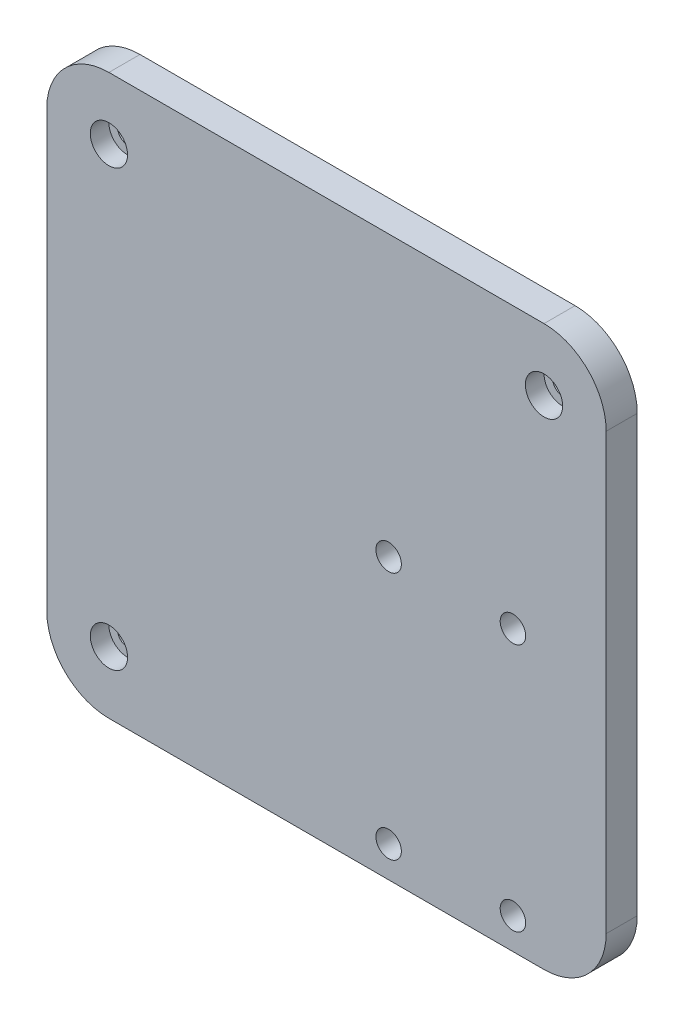
ISO-10303-21;
HEADER;
FILE_DESCRIPTION(('STEP AP214'),'2;1');
FILE_NAME('part.step','',(''),(''),'','','');
FILE_SCHEMA(('AUTOMOTIVE_DESIGN { 1 0 10303 214 1 1 1 1 }'));
ENDSEC;
DATA;
#1=APPLICATION_CONTEXT('core data for automotive mechanical design processes');
#2=APPLICATION_PROTOCOL_DEFINITION('international standard','automotive_design',2000,#1);
#3=PRODUCT_CONTEXT('',#1,'mechanical');
#4=PRODUCT('Part','Part','',(#3));
#5=PRODUCT_RELATED_PRODUCT_CATEGORY('part','',(#4));
#6=PRODUCT_DEFINITION_FORMATION('','',#4);
#7=PRODUCT_DEFINITION_CONTEXT('part definition',#1,'design');
#8=PRODUCT_DEFINITION('design','',#6,#7);
#9=PRODUCT_DEFINITION_SHAPE('','',#8);
#10=(LENGTH_UNIT() NAMED_UNIT(*) SI_UNIT(.MILLI.,.METRE.));
#11=(NAMED_UNIT(*) PLANE_ANGLE_UNIT() SI_UNIT($,.RADIAN.));
#12=(NAMED_UNIT(*) SI_UNIT($,.STERADIAN.) SOLID_ANGLE_UNIT());
#13=UNCERTAINTY_MEASURE_WITH_UNIT(LENGTH_MEASURE(1.E-05),#10,'distance_accuracy_value','');
#14=(GEOMETRIC_REPRESENTATION_CONTEXT(3) GLOBAL_UNCERTAINTY_ASSIGNED_CONTEXT((#13)) GLOBAL_UNIT_ASSIGNED_CONTEXT((#10,
#11,#12)) REPRESENTATION_CONTEXT('',''));
#15=CARTESIAN_POINT('',(0.,0.,0.));
#16=DIRECTION('',(0.,0.,1.));
#17=DIRECTION('',(1.,0.,0.));
#18=AXIS2_PLACEMENT_3D('',#15,#16,#17);
#19=CARTESIAN_POINT('',(-35.,-35.,5.));
#20=DIRECTION('',(0.,0.,-1.));
#21=DIRECTION('',(-1.,0.,0.));
#22=AXIS2_PLACEMENT_3D('',#19,#20,#21);
#23=CYLINDRICAL_SURFACE('',#22,1.60000000000001);
#24=CARTESIAN_POINT('',(-35.,-35.,0.));
#25=DIRECTION('',(0.,0.,1.));
#26=DIRECTION('',(1.,0.,0.));
#27=AXIS2_PLACEMENT_3D('',#24,#25,#26);
#28=CIRCLE('',#27,1.60000000000001);
#29=CARTESIAN_POINT('',(-33.4,-35.,0.));
#30=VERTEX_POINT('',#29);
#31=EDGE_CURVE('E136',#30,#30,#28,.T.);
#32=ORIENTED_EDGE('',*,*,#31,.F.);
#33=EDGE_LOOP('',(#32));
#34=FACE_BOUND('',#33,.T.);
#35=CARTESIAN_POINT('',(-35.,-35.,2.));
#36=DIRECTION('',(0.,0.,1.));
#37=DIRECTION('',(1.,0.,0.));
#38=AXIS2_PLACEMENT_3D('',#35,#36,#37);
#39=CIRCLE('',#38,1.60000000000001);
#40=CARTESIAN_POINT('',(-33.4,-35.,2.));
#41=VERTEX_POINT('',#40);
#42=EDGE_CURVE('E37',#41,#41,#39,.T.);
#43=ORIENTED_EDGE('',*,*,#42,.T.);
#44=EDGE_LOOP('',(#43));
#45=FACE_BOUND('',#44,.T.);
#46=ADVANCED_FACE('F33',(#34,#45),#23,.F.);
#47=CARTESIAN_POINT('',(-35.,35.,5.));
#48=DIRECTION('',(0.,0.,-1.));
#49=DIRECTION('',(-1.,0.,0.));
#50=AXIS2_PLACEMENT_3D('',#47,#48,#49);
#51=CYLINDRICAL_SURFACE('',#50,1.60000000000001);
#52=CARTESIAN_POINT('',(-35.,35.,0.));
#53=DIRECTION('',(0.,0.,1.));
#54=DIRECTION('',(1.,0.,0.));
#55=AXIS2_PLACEMENT_3D('',#52,#53,#54);
#56=CIRCLE('',#55,1.60000000000001);
#57=CARTESIAN_POINT('',(-33.4,35.,0.));
#58=VERTEX_POINT('',#57);
#59=EDGE_CURVE('E171',#58,#58,#56,.T.);
#60=ORIENTED_EDGE('',*,*,#59,.F.);
#61=EDGE_LOOP('',(#60));
#62=FACE_BOUND('',#61,.T.);
#63=CARTESIAN_POINT('',(-35.,35.,2.));
#64=DIRECTION('',(0.,0.,1.));
#65=DIRECTION('',(1.,0.,0.));
#66=AXIS2_PLACEMENT_3D('',#63,#64,#65);
#67=CIRCLE('',#66,1.60000000000001);
#68=CARTESIAN_POINT('',(-33.4,35.,2.));
#69=VERTEX_POINT('',#68);
#70=EDGE_CURVE('E161',#69,#69,#67,.T.);
#71=ORIENTED_EDGE('',*,*,#70,.T.);
#72=EDGE_LOOP('',(#71));
#73=FACE_BOUND('',#72,.T.);
#74=ADVANCED_FACE('F220',(#62,#73),#51,.F.);
#75=CARTESIAN_POINT('',(35.,35.,5.));
#76=DIRECTION('',(0.,0.,-1.));
#77=DIRECTION('',(-1.,0.,0.));
#78=AXIS2_PLACEMENT_3D('',#75,#76,#77);
#79=CYLINDRICAL_SURFACE('',#78,1.60000000000001);
#80=CARTESIAN_POINT('',(35.,35.,0.));
#81=DIRECTION('',(0.,0.,1.));
#82=DIRECTION('',(1.,0.,0.));
#83=AXIS2_PLACEMENT_3D('',#80,#81,#82);
#84=CIRCLE('',#83,1.60000000000001);
#85=CARTESIAN_POINT('',(36.6,35.,0.));
#86=VERTEX_POINT('',#85);
#87=EDGE_CURVE('E167',#86,#86,#84,.T.);
#88=ORIENTED_EDGE('',*,*,#87,.F.);
#89=EDGE_LOOP('',(#88));
#90=FACE_BOUND('',#89,.T.);
#91=CARTESIAN_POINT('',(35.,35.,2.));
#92=DIRECTION('',(0.,0.,1.));
#93=DIRECTION('',(1.,0.,0.));
#94=AXIS2_PLACEMENT_3D('',#91,#92,#93);
#95=CIRCLE('',#94,1.60000000000001);
#96=CARTESIAN_POINT('',(36.6,35.,2.));
#97=VERTEX_POINT('',#96);
#98=EDGE_CURVE('E159',#97,#97,#95,.T.);
#99=ORIENTED_EDGE('',*,*,#98,.T.);
#100=EDGE_LOOP('',(#99));
#101=FACE_BOUND('',#100,.T.);
#102=ADVANCED_FACE('F226',(#90,#101),#79,.F.);
#103=CARTESIAN_POINT('',(35.,35.,5.));
#104=DIRECTION('',(0.,0.,-1.));
#105=DIRECTION('',(-1.,0.,0.));
#106=AXIS2_PLACEMENT_3D('',#103,#104,#105);
#107=PLANE('',#106);
#108=CARTESIAN_POINT('',(30.,-40.,5.));
#109=DIRECTION('',(0.,0.,1.));
#110=DIRECTION('',(1.,0.,0.));
#111=AXIS2_PLACEMENT_3D('',#108,#109,#110);
#112=CIRCLE('',#111,2.05);
#113=CARTESIAN_POINT('',(32.05,-40.,5.));
#114=VERTEX_POINT('',#113);
#115=EDGE_CURVE('E267',#114,#114,#112,.T.);
#116=ORIENTED_EDGE('',*,*,#115,.F.);
#117=EDGE_LOOP('',(#116));
#118=FACE_BOUND('',#117,.T.);
#119=CARTESIAN_POINT('',(10.,-40.,5.));
#120=DIRECTION('',(0.,0.,1.));
#121=DIRECTION('',(1.,0.,0.));
#122=AXIS2_PLACEMENT_3D('',#119,#120,#121);
#123=CIRCLE('',#122,2.05);
#124=CARTESIAN_POINT('',(12.05,-40.,5.));
#125=VERTEX_POINT('',#124);
#126=EDGE_CURVE('E478',#125,#125,#123,.T.);
#127=ORIENTED_EDGE('',*,*,#126,.F.);
#128=EDGE_LOOP('',(#127));
#129=FACE_BOUND('',#128,.T.);
#130=CARTESIAN_POINT('',(10.,0.,5.));
#131=DIRECTION('',(0.,0.,1.));
#132=DIRECTION('',(1.,0.,0.));
#133=AXIS2_PLACEMENT_3D('',#130,#131,#132);
#134=CIRCLE('',#133,2.05);
#135=CARTESIAN_POINT('',(12.05,0.,5.));
#136=VERTEX_POINT('',#135);
#137=EDGE_CURVE('E483',#136,#136,#134,.T.);
#138=ORIENTED_EDGE('',*,*,#137,.F.);
#139=EDGE_LOOP('',(#138));
#140=FACE_BOUND('',#139,.T.);
#141=CARTESIAN_POINT('',(30.,0.,5.));
#142=DIRECTION('',(0.,0.,1.));
#143=DIRECTION('',(1.,0.,0.));
#144=AXIS2_PLACEMENT_3D('',#141,#142,#143);
#145=CIRCLE('',#144,2.05);
#146=CARTESIAN_POINT('',(32.05,0.,5.));
#147=VERTEX_POINT('',#146);
#148=EDGE_CURVE('E259',#147,#147,#145,.T.);
#149=ORIENTED_EDGE('',*,*,#148,.F.);
#150=EDGE_LOOP('',(#149));
#151=FACE_BOUND('',#150,.T.);
#152=CARTESIAN_POINT('',(-35.,-35.,5.));
#153=DIRECTION('',(0.,0.,1.));
#154=DIRECTION('',(1.,0.,0.));
#155=AXIS2_PLACEMENT_3D('',#152,#153,#154);
#156=CIRCLE('',#155,2.99999999999999);
#157=CARTESIAN_POINT('',(-32.,-35.,5.));
#158=VERTEX_POINT('',#157);
#159=EDGE_CURVE('E258',#158,#158,#156,.T.);
#160=ORIENTED_EDGE('',*,*,#159,.F.);
#161=EDGE_LOOP('',(#160));
#162=FACE_BOUND('',#161,.T.);
#163=CARTESIAN_POINT('',(35.,35.,5.));
#164=DIRECTION('',(0.,0.,1.));
#165=DIRECTION('',(1.,0.,0.));
#166=AXIS2_PLACEMENT_3D('',#163,#164,#165);
#167=CIRCLE('',#166,3.);
#168=CARTESIAN_POINT('',(38.,35.,5.));
#169=VERTEX_POINT('',#168);
#170=EDGE_CURVE('E273',#169,#169,#167,.T.);
#171=ORIENTED_EDGE('',*,*,#170,.F.);
#172=EDGE_LOOP('',(#171));
#173=FACE_BOUND('',#172,.T.);
#174=CARTESIAN_POINT('',(-35.,35.,5.));
#175=DIRECTION('',(0.,0.,1.));
#176=DIRECTION('',(1.,0.,0.));
#177=AXIS2_PLACEMENT_3D('',#174,#175,#176);
#178=CIRCLE('',#177,2.99999999999999);
#179=CARTESIAN_POINT('',(-32.,35.,5.));
#180=VERTEX_POINT('',#179);
#181=EDGE_CURVE('E178',#180,#180,#178,.T.);
#182=ORIENTED_EDGE('',*,*,#181,.F.);
#183=EDGE_LOOP('',(#182));
#184=FACE_BOUND('',#183,.T.);
#185=CARTESIAN_POINT('',(35.,35.,5.));
#186=DIRECTION('',(0.,0.,1.));
#187=DIRECTION('',(-1.,0.,0.));
#188=AXIS2_PLACEMENT_3D('',#185,#186,#187);
#189=CIRCLE('',#188,10.);
#190=CARTESIAN_POINT('',(45.,35.,5.));
#191=VERTEX_POINT('',#190);
#192=CARTESIAN_POINT('',(35.,45.,5.));
#193=VERTEX_POINT('',#192);
#194=EDGE_CURVE('E147',#191,#193,#189,.T.);
#195=ORIENTED_EDGE('',*,*,#194,.T.);
#196=DIRECTION('',(-1.,0.,0.));
#197=VECTOR('',#196,1.);
#198=CARTESIAN_POINT('',(-35.,45.,5.));
#199=LINE('',#198,#197);
#200=CARTESIAN_POINT('',(-35.,45.,5.));
#201=VERTEX_POINT('',#200);
#202=EDGE_CURVE('E95',#193,#201,#199,.T.);
#203=ORIENTED_EDGE('',*,*,#202,.T.);
#204=CARTESIAN_POINT('',(-35.,35.,5.));
#205=DIRECTION('',(0.,0.,1.));
#206=DIRECTION('',(1.,0.,0.));
#207=AXIS2_PLACEMENT_3D('',#204,#205,#206);
#208=CIRCLE('',#207,10.);
#209=CARTESIAN_POINT('',(-45.,35.,5.));
#210=VERTEX_POINT('',#209);
#211=EDGE_CURVE('E185',#201,#210,#208,.T.);
#212=ORIENTED_EDGE('',*,*,#211,.T.);
#213=DIRECTION('',(0.,-1.,0.));
#214=VECTOR('',#213,1.);
#215=CARTESIAN_POINT('',(-45.,35.,5.));
#216=LINE('',#215,#214);
#217=CARTESIAN_POINT('',(-45.,-35.,5.));
#218=VERTEX_POINT('',#217);
#219=EDGE_CURVE('E187',#210,#218,#216,.T.);
#220=ORIENTED_EDGE('',*,*,#219,.T.);
#221=CARTESIAN_POINT('',(-35.,-35.,5.));
#222=DIRECTION('',(0.,0.,1.));
#223=DIRECTION('',(1.,0.,0.));
#224=AXIS2_PLACEMENT_3D('',#221,#222,#223);
#225=CIRCLE('',#224,10.);
#226=CARTESIAN_POINT('',(-35.,-45.,5.));
#227=VERTEX_POINT('',#226);
#228=EDGE_CURVE('E114',#218,#227,#225,.T.);
#229=ORIENTED_EDGE('',*,*,#228,.T.);
#230=DIRECTION('',(1.,0.,0.));
#231=VECTOR('',#230,1.);
#232=CARTESIAN_POINT('',(-35.,-45.,5.));
#233=LINE('',#232,#231);
#234=CARTESIAN_POINT('',(35.,-45.,5.));
#235=VERTEX_POINT('',#234);
#236=EDGE_CURVE('E108',#227,#235,#233,.T.);
#237=ORIENTED_EDGE('',*,*,#236,.T.);
#238=CARTESIAN_POINT('',(35.,-35.,5.));
#239=DIRECTION('',(0.,0.,1.));
#240=DIRECTION('',(1.,0.,0.));
#241=AXIS2_PLACEMENT_3D('',#238,#239,#240);
#242=CIRCLE('',#241,10.);
#243=CARTESIAN_POINT('',(45.,-35.,5.));
#244=VERTEX_POINT('',#243);
#245=EDGE_CURVE('E112',#235,#244,#242,.T.);
#246=ORIENTED_EDGE('',*,*,#245,.T.);
#247=DIRECTION('',(0.,1.,0.));
#248=VECTOR('',#247,1.);
#249=CARTESIAN_POINT('',(45.,35.,5.));
#250=LINE('',#249,#248);
#251=EDGE_CURVE('E52',#244,#191,#250,.T.);
#252=ORIENTED_EDGE('',*,*,#251,.T.);
#253=EDGE_LOOP('',(#195,#203,#212,#220,#229,#237,#246,#252));
#254=FACE_BOUND('',#253,.T.);
#255=ADVANCED_FACE('F110',(#118,#129,#140,#151,#162,#173,#184,#254),#107,.F.);
#256=CARTESIAN_POINT('',(35.,35.,0.));
#257=DIRECTION('',(0.,0.,-1.));
#258=DIRECTION('',(-1.,0.,0.));
#259=AXIS2_PLACEMENT_3D('',#256,#257,#258);
#260=PLANE('',#259);
#261=CARTESIAN_POINT('',(30.,-40.,0.));
#262=DIRECTION('',(0.,0.,1.));
#263=DIRECTION('',(1.,0.,0.));
#264=AXIS2_PLACEMENT_3D('',#261,#262,#263);
#265=CIRCLE('',#264,2.05);
#266=CARTESIAN_POINT('',(32.05,-40.,0.));
#267=VERTEX_POINT('',#266);
#268=EDGE_CURVE('E243',#267,#267,#265,.T.);
#269=ORIENTED_EDGE('',*,*,#268,.T.);
#270=EDGE_LOOP('',(#269));
#271=FACE_BOUND('',#270,.T.);
#272=CARTESIAN_POINT('',(10.,-40.,0.));
#273=DIRECTION('',(0.,0.,1.));
#274=DIRECTION('',(1.,0.,0.));
#275=AXIS2_PLACEMENT_3D('',#272,#273,#274);
#276=CIRCLE('',#275,2.05);
#277=CARTESIAN_POINT('',(12.05,-40.,0.));
#278=VERTEX_POINT('',#277);
#279=EDGE_CURVE('E247',#278,#278,#276,.T.);
#280=ORIENTED_EDGE('',*,*,#279,.T.);
#281=EDGE_LOOP('',(#280));
#282=FACE_BOUND('',#281,.T.);
#283=CARTESIAN_POINT('',(10.,0.,0.));
#284=DIRECTION('',(0.,0.,1.));
#285=DIRECTION('',(1.,0.,0.));
#286=AXIS2_PLACEMENT_3D('',#283,#284,#285);
#287=CIRCLE('',#286,2.05);
#288=CARTESIAN_POINT('',(12.05,0.,0.));
#289=VERTEX_POINT('',#288);
#290=EDGE_CURVE('E251',#289,#289,#287,.T.);
#291=ORIENTED_EDGE('',*,*,#290,.T.);
#292=EDGE_LOOP('',(#291));
#293=FACE_BOUND('',#292,.T.);
#294=CARTESIAN_POINT('',(30.,0.,0.));
#295=DIRECTION('',(0.,0.,1.));
#296=DIRECTION('',(1.,0.,0.));
#297=AXIS2_PLACEMENT_3D('',#294,#295,#296);
#298=CIRCLE('',#297,2.05);
#299=CARTESIAN_POINT('',(32.05,0.,0.));
#300=VERTEX_POINT('',#299);
#301=EDGE_CURVE('E255',#300,#300,#298,.T.);
#302=ORIENTED_EDGE('',*,*,#301,.T.);
#303=EDGE_LOOP('',(#302));
#304=FACE_BOUND('',#303,.T.);
#305=ORIENTED_EDGE('',*,*,#59,.T.);
#306=EDGE_LOOP('',(#305));
#307=FACE_BOUND('',#306,.T.);
#308=CARTESIAN_POINT('',(35.,35.,0.));
#309=DIRECTION('',(0.,0.,1.));
#310=DIRECTION('',(-1.,0.,0.));
#311=AXIS2_PLACEMENT_3D('',#308,#309,#310);
#312=CIRCLE('',#311,10.);
#313=CARTESIAN_POINT('',(45.,35.,0.));
#314=VERTEX_POINT('',#313);
#315=CARTESIAN_POINT('',(35.,45.,0.));
#316=VERTEX_POINT('',#315);
#317=EDGE_CURVE('E132',#314,#316,#312,.T.);
#318=ORIENTED_EDGE('',*,*,#317,.F.);
#319=DIRECTION('',(0.,1.,0.));
#320=VECTOR('',#319,1.);
#321=CARTESIAN_POINT('',(45.,35.,0.));
#322=LINE('',#321,#320);
#323=CARTESIAN_POINT('',(45.,-35.,0.));
#324=VERTEX_POINT('',#323);
#325=EDGE_CURVE('E87',#324,#314,#322,.T.);
#326=ORIENTED_EDGE('',*,*,#325,.F.);
#327=CARTESIAN_POINT('',(35.,-35.,0.));
#328=DIRECTION('',(0.,0.,1.));
#329=DIRECTION('',(1.,0.,0.));
#330=AXIS2_PLACEMENT_3D('',#327,#328,#329);
#331=CIRCLE('',#330,10.);
#332=CARTESIAN_POINT('',(35.,-45.,0.));
#333=VERTEX_POINT('',#332);
#334=EDGE_CURVE('E81',#333,#324,#331,.T.);
#335=ORIENTED_EDGE('',*,*,#334,.F.);
#336=DIRECTION('',(1.,0.,0.));
#337=VECTOR('',#336,1.);
#338=CARTESIAN_POINT('',(-35.,-45.,0.));
#339=LINE('',#338,#337);
#340=CARTESIAN_POINT('',(-35.,-45.,0.));
#341=VERTEX_POINT('',#340);
#342=EDGE_CURVE('E122',#341,#333,#339,.T.);
#343=ORIENTED_EDGE('',*,*,#342,.F.);
#344=CARTESIAN_POINT('',(-35.,-35.,0.));
#345=DIRECTION('',(0.,0.,1.));
#346=DIRECTION('',(1.,0.,0.));
#347=AXIS2_PLACEMENT_3D('',#344,#345,#346);
#348=CIRCLE('',#347,10.);
#349=CARTESIAN_POINT('',(-45.,-35.,0.));
#350=VERTEX_POINT('',#349);
#351=EDGE_CURVE('E142',#350,#341,#348,.T.);
#352=ORIENTED_EDGE('',*,*,#351,.F.);
#353=DIRECTION('',(0.,-1.,0.));
#354=VECTOR('',#353,1.);
#355=CARTESIAN_POINT('',(-45.,35.,0.));
#356=LINE('',#355,#354);
#357=CARTESIAN_POINT('',(-45.,35.,0.));
#358=VERTEX_POINT('',#357);
#359=EDGE_CURVE('E140',#358,#350,#356,.T.);
#360=ORIENTED_EDGE('',*,*,#359,.F.);
#361=CARTESIAN_POINT('',(-35.,35.,0.));
#362=DIRECTION('',(0.,0.,1.));
#363=DIRECTION('',(1.,0.,0.));
#364=AXIS2_PLACEMENT_3D('',#361,#362,#363);
#365=CIRCLE('',#364,10.);
#366=CARTESIAN_POINT('',(-35.,45.,0.));
#367=VERTEX_POINT('',#366);
#368=EDGE_CURVE('E138',#367,#358,#365,.T.);
#369=ORIENTED_EDGE('',*,*,#368,.F.);
#370=DIRECTION('',(-1.,0.,0.));
#371=VECTOR('',#370,1.);
#372=CARTESIAN_POINT('',(-35.,45.,0.));
#373=LINE('',#372,#371);
#374=EDGE_CURVE('E135',#316,#367,#373,.T.);
#375=ORIENTED_EDGE('',*,*,#374,.F.);
#376=EDGE_LOOP('',(#318,#326,#335,#343,#352,#360,#369,#375));
#377=FACE_BOUND('',#376,.T.);
#378=ORIENTED_EDGE('',*,*,#31,.T.);
#379=EDGE_LOOP('',(#378));
#380=FACE_BOUND('',#379,.T.);
#381=ORIENTED_EDGE('',*,*,#87,.T.);
#382=EDGE_LOOP('',(#381));
#383=FACE_BOUND('',#382,.T.);
#384=ADVANCED_FACE('F200',(#271,#282,#293,#304,#307,#377,#380,#383),#260,.T.);
#385=CARTESIAN_POINT('',(35.,35.,5.));
#386=DIRECTION('',(0.,0.,-1.));
#387=DIRECTION('',(-1.,0.,0.));
#388=AXIS2_PLACEMENT_3D('',#385,#386,#387);
#389=CYLINDRICAL_SURFACE('',#388,10.);
#390=ORIENTED_EDGE('',*,*,#317,.T.);
#391=DIRECTION('',(0.,0.,-1.));
#392=VECTOR('',#391,1.);
#393=CARTESIAN_POINT('',(35.,45.,5.));
#394=LINE('',#393,#392);
#395=EDGE_CURVE('E11',#193,#316,#394,.T.);
#396=ORIENTED_EDGE('',*,*,#395,.F.);
#397=ORIENTED_EDGE('',*,*,#194,.F.);
#398=DIRECTION('',(0.,0.,-1.));
#399=VECTOR('',#398,1.);
#400=CARTESIAN_POINT('',(45.,35.,5.));
#401=LINE('',#400,#399);
#402=EDGE_CURVE('E128',#191,#314,#401,.T.);
#403=ORIENTED_EDGE('',*,*,#402,.T.);
#404=EDGE_LOOP('',(#390,#396,#397,#403));
#405=FACE_BOUND('',#404,.T.);
#406=ADVANCED_FACE('F35',(#405),#389,.T.);
#407=CARTESIAN_POINT('',(-35.,45.,5.));
#408=DIRECTION('',(0.,-1.,0.));
#409=DIRECTION('',(0.,0.,-1.));
#410=AXIS2_PLACEMENT_3D('',#407,#408,#409);
#411=PLANE('',#410);
#412=ORIENTED_EDGE('',*,*,#374,.T.);
#413=DIRECTION('',(0.,0.,-1.));
#414=VECTOR('',#413,1.);
#415=CARTESIAN_POINT('',(-35.,45.,5.));
#416=LINE('',#415,#414);
#417=EDGE_CURVE('E43',#201,#367,#416,.T.);
#418=ORIENTED_EDGE('',*,*,#417,.F.);
#419=ORIENTED_EDGE('',*,*,#202,.F.);
#420=ORIENTED_EDGE('',*,*,#395,.T.);
#421=EDGE_LOOP('',(#412,#418,#419,#420));
#422=FACE_BOUND('',#421,.T.);
#423=ADVANCED_FACE('F239',(#422),#411,.F.);
#424=CARTESIAN_POINT('',(-35.,35.,5.));
#425=DIRECTION('',(0.,0.,-1.));
#426=DIRECTION('',(-1.,0.,0.));
#427=AXIS2_PLACEMENT_3D('',#424,#425,#426);
#428=CYLINDRICAL_SURFACE('',#427,10.);
#429=ORIENTED_EDGE('',*,*,#368,.T.);
#430=DIRECTION('',(0.,0.,-1.));
#431=VECTOR('',#430,1.);
#432=CARTESIAN_POINT('',(-45.,35.,5.));
#433=LINE('',#432,#431);
#434=EDGE_CURVE('E154',#210,#358,#433,.T.);
#435=ORIENTED_EDGE('',*,*,#434,.F.);
#436=ORIENTED_EDGE('',*,*,#211,.F.);
#437=ORIENTED_EDGE('',*,*,#417,.T.);
#438=EDGE_LOOP('',(#429,#435,#436,#437));
#439=FACE_BOUND('',#438,.T.);
#440=ADVANCED_FACE('F445',(#439),#428,.T.);
#441=CARTESIAN_POINT('',(-45.,35.,5.));
#442=DIRECTION('',(1.,0.,0.));
#443=DIRECTION('',(0.,0.,-1.));
#444=AXIS2_PLACEMENT_3D('',#441,#442,#443);
#445=PLANE('',#444);
#446=ORIENTED_EDGE('',*,*,#359,.T.);
#447=DIRECTION('',(0.,0.,-1.));
#448=VECTOR('',#447,1.);
#449=CARTESIAN_POINT('',(-45.,-35.,5.));
#450=LINE('',#449,#448);
#451=EDGE_CURVE('E151',#218,#350,#450,.T.);
#452=ORIENTED_EDGE('',*,*,#451,.F.);
#453=ORIENTED_EDGE('',*,*,#219,.F.);
#454=ORIENTED_EDGE('',*,*,#434,.T.);
#455=EDGE_LOOP('',(#446,#452,#453,#454));
#456=FACE_BOUND('',#455,.T.);
#457=ADVANCED_FACE('F193',(#456),#445,.F.);
#458=CARTESIAN_POINT('',(-35.,-35.,5.));
#459=DIRECTION('',(0.,0.,-1.));
#460=DIRECTION('',(-1.,0.,0.));
#461=AXIS2_PLACEMENT_3D('',#458,#459,#460);
#462=CYLINDRICAL_SURFACE('',#461,10.);
#463=ORIENTED_EDGE('',*,*,#351,.T.);
#464=DIRECTION('',(0.,0.,-1.));
#465=VECTOR('',#464,1.);
#466=CARTESIAN_POINT('',(-35.,-45.,5.));
#467=LINE('',#466,#465);
#468=EDGE_CURVE('E123',#227,#341,#467,.T.);
#469=ORIENTED_EDGE('',*,*,#468,.F.);
#470=ORIENTED_EDGE('',*,*,#228,.F.);
#471=ORIENTED_EDGE('',*,*,#451,.T.);
#472=EDGE_LOOP('',(#463,#469,#470,#471));
#473=FACE_BOUND('',#472,.T.);
#474=ADVANCED_FACE('F197',(#473),#462,.T.);
#475=CARTESIAN_POINT('',(-35.,-45.,5.));
#476=DIRECTION('',(0.,1.,0.));
#477=DIRECTION('',(-1.,0.,0.));
#478=AXIS2_PLACEMENT_3D('',#475,#476,#477);
#479=PLANE('',#478);
#480=ORIENTED_EDGE('',*,*,#342,.T.);
#481=DIRECTION('',(0.,0.,-1.));
#482=VECTOR('',#481,1.);
#483=CARTESIAN_POINT('',(35.,-45.,5.));
#484=LINE('',#483,#482);
#485=EDGE_CURVE('E119',#235,#333,#484,.T.);
#486=ORIENTED_EDGE('',*,*,#485,.F.);
#487=ORIENTED_EDGE('',*,*,#236,.F.);
#488=ORIENTED_EDGE('',*,*,#468,.T.);
#489=EDGE_LOOP('',(#480,#486,#487,#488));
#490=FACE_BOUND('',#489,.T.);
#491=ADVANCED_FACE('F120',(#490),#479,.F.);
#492=CARTESIAN_POINT('',(35.,-35.,5.));
#493=DIRECTION('',(0.,0.,-1.));
#494=DIRECTION('',(-1.,0.,0.));
#495=AXIS2_PLACEMENT_3D('',#492,#493,#494);
#496=CYLINDRICAL_SURFACE('',#495,10.);
#497=ORIENTED_EDGE('',*,*,#334,.T.);
#498=DIRECTION('',(0.,0.,-1.));
#499=VECTOR('',#498,1.);
#500=CARTESIAN_POINT('',(45.,-35.,5.));
#501=LINE('',#500,#499);
#502=EDGE_CURVE('E124',#244,#324,#501,.T.);
#503=ORIENTED_EDGE('',*,*,#502,.F.);
#504=ORIENTED_EDGE('',*,*,#245,.F.);
#505=ORIENTED_EDGE('',*,*,#485,.T.);
#506=EDGE_LOOP('',(#497,#503,#504,#505));
#507=FACE_BOUND('',#506,.T.);
#508=ADVANCED_FACE('F126',(#507),#496,.T.);
#509=CARTESIAN_POINT('',(45.,35.,5.));
#510=DIRECTION('',(-1.,0.,0.));
#511=DIRECTION('',(0.,0.,1.));
#512=AXIS2_PLACEMENT_3D('',#509,#510,#511);
#513=PLANE('',#512);
#514=ORIENTED_EDGE('',*,*,#325,.T.);
#515=ORIENTED_EDGE('',*,*,#402,.F.);
#516=ORIENTED_EDGE('',*,*,#251,.F.);
#517=ORIENTED_EDGE('',*,*,#502,.T.);
#518=EDGE_LOOP('',(#514,#515,#516,#517));
#519=FACE_BOUND('',#518,.T.);
#520=ADVANCED_FACE('F206',(#519),#513,.F.);
#521=CARTESIAN_POINT('',(35.,35.,2.));
#522=DIRECTION('',(0.,0.,1.));
#523=DIRECTION('',(1.,0.,0.));
#524=AXIS2_PLACEMENT_3D('',#521,#522,#523);
#525=CYLINDRICAL_SURFACE('',#524,3.);
#526=CARTESIAN_POINT('',(35.,35.,2.));
#527=DIRECTION('',(0.,0.,1.));
#528=DIRECTION('',(1.,0.,0.));
#529=AXIS2_PLACEMENT_3D('',#526,#527,#528);
#530=CIRCLE('',#529,3.);
#531=CARTESIAN_POINT('',(38.,35.,2.));
#532=VERTEX_POINT('',#531);
#533=EDGE_CURVE('E270',#532,#532,#530,.T.);
#534=ORIENTED_EDGE('',*,*,#533,.F.);
#535=EDGE_LOOP('',(#534));
#536=FACE_BOUND('',#535,.T.);
#537=ORIENTED_EDGE('',*,*,#170,.T.);
#538=EDGE_LOOP('',(#537));
#539=FACE_BOUND('',#538,.T.);
#540=ADVANCED_FACE('F208',(#536,#539),#525,.F.);
#541=CARTESIAN_POINT('',(35.,35.,2.));
#542=DIRECTION('',(0.,0.,1.));
#543=DIRECTION('',(1.,0.,0.));
#544=AXIS2_PLACEMENT_3D('',#541,#542,#543);
#545=PLANE('',#544);
#546=ORIENTED_EDGE('',*,*,#98,.F.);
#547=EDGE_LOOP('',(#546));
#548=FACE_BOUND('',#547,.T.);
#549=ORIENTED_EDGE('',*,*,#533,.T.);
#550=EDGE_LOOP('',(#549));
#551=FACE_BOUND('',#550,.T.);
#552=ADVANCED_FACE('F214',(#548,#551),#545,.T.);
#553=CARTESIAN_POINT('',(-35.,35.,2.));
#554=DIRECTION('',(0.,0.,1.));
#555=DIRECTION('',(1.,0.,0.));
#556=AXIS2_PLACEMENT_3D('',#553,#554,#555);
#557=CYLINDRICAL_SURFACE('',#556,2.99999999999999);
#558=CARTESIAN_POINT('',(-35.,35.,2.));
#559=DIRECTION('',(0.,0.,1.));
#560=DIRECTION('',(1.,0.,0.));
#561=AXIS2_PLACEMENT_3D('',#558,#559,#560);
#562=CIRCLE('',#561,2.99999999999999);
#563=CARTESIAN_POINT('',(-32.,35.,2.));
#564=VERTEX_POINT('',#563);
#565=EDGE_CURVE('E162',#564,#564,#562,.T.);
#566=ORIENTED_EDGE('',*,*,#565,.F.);
#567=EDGE_LOOP('',(#566));
#568=FACE_BOUND('',#567,.T.);
#569=ORIENTED_EDGE('',*,*,#181,.T.);
#570=EDGE_LOOP('',(#569));
#571=FACE_BOUND('',#570,.T.);
#572=ADVANCED_FACE('F283',(#568,#571),#557,.F.);
#573=CARTESIAN_POINT('',(-35.,35.,2.));
#574=DIRECTION('',(0.,0.,1.));
#575=DIRECTION('',(1.,0.,0.));
#576=AXIS2_PLACEMENT_3D('',#573,#574,#575);
#577=PLANE('',#576);
#578=ORIENTED_EDGE('',*,*,#70,.F.);
#579=EDGE_LOOP('',(#578));
#580=FACE_BOUND('',#579,.T.);
#581=ORIENTED_EDGE('',*,*,#565,.T.);
#582=EDGE_LOOP('',(#581));
#583=FACE_BOUND('',#582,.T.);
#584=ADVANCED_FACE('F286',(#580,#583),#577,.T.);
#585=CARTESIAN_POINT('',(-35.,-35.,2.));
#586=DIRECTION('',(0.,0.,1.));
#587=DIRECTION('',(1.,0.,0.));
#588=AXIS2_PLACEMENT_3D('',#585,#586,#587);
#589=CYLINDRICAL_SURFACE('',#588,2.99999999999999);
#590=CARTESIAN_POINT('',(-35.,-35.,2.));
#591=DIRECTION('',(0.,0.,1.));
#592=DIRECTION('',(1.,0.,0.));
#593=AXIS2_PLACEMENT_3D('',#590,#591,#592);
#594=CIRCLE('',#593,2.99999999999999);
#595=CARTESIAN_POINT('',(-32.,-35.,2.));
#596=VERTEX_POINT('',#595);
#597=EDGE_CURVE('E262',#596,#596,#594,.T.);
#598=ORIENTED_EDGE('',*,*,#597,.F.);
#599=EDGE_LOOP('',(#598));
#600=FACE_BOUND('',#599,.T.);
#601=ORIENTED_EDGE('',*,*,#159,.T.);
#602=EDGE_LOOP('',(#601));
#603=FACE_BOUND('',#602,.T.);
#604=ADVANCED_FACE('F293',(#600,#603),#589,.F.);
#605=CARTESIAN_POINT('',(-35.,-35.,2.));
#606=DIRECTION('',(0.,0.,1.));
#607=DIRECTION('',(1.,0.,0.));
#608=AXIS2_PLACEMENT_3D('',#605,#606,#607);
#609=PLANE('',#608);
#610=ORIENTED_EDGE('',*,*,#42,.F.);
#611=EDGE_LOOP('',(#610));
#612=FACE_BOUND('',#611,.T.);
#613=ORIENTED_EDGE('',*,*,#597,.T.);
#614=EDGE_LOOP('',(#613));
#615=FACE_BOUND('',#614,.T.);
#616=ADVANCED_FACE('F323',(#612,#615),#609,.T.);
#617=CARTESIAN_POINT('',(30.,0.,0.));
#618=DIRECTION('',(0.,0.,1.));
#619=DIRECTION('',(1.,0.,0.));
#620=AXIS2_PLACEMENT_3D('',#617,#618,#619);
#621=CYLINDRICAL_SURFACE('',#620,2.05);
#622=ORIENTED_EDGE('',*,*,#301,.F.);
#623=EDGE_LOOP('',(#622));
#624=FACE_BOUND('',#623,.T.);
#625=ORIENTED_EDGE('',*,*,#148,.T.);
#626=EDGE_LOOP('',(#625));
#627=FACE_BOUND('',#626,.T.);
#628=ADVANCED_FACE('F333',(#624,#627),#621,.F.);
#629=CARTESIAN_POINT('',(10.,0.,0.));
#630=DIRECTION('',(0.,0.,1.));
#631=DIRECTION('',(1.,0.,0.));
#632=AXIS2_PLACEMENT_3D('',#629,#630,#631);
#633=CYLINDRICAL_SURFACE('',#632,2.05);
#634=ORIENTED_EDGE('',*,*,#290,.F.);
#635=EDGE_LOOP('',(#634));
#636=FACE_BOUND('',#635,.T.);
#637=ORIENTED_EDGE('',*,*,#137,.T.);
#638=EDGE_LOOP('',(#637));
#639=FACE_BOUND('',#638,.T.);
#640=ADVANCED_FACE('F338',(#636,#639),#633,.F.);
#641=CARTESIAN_POINT('',(10.,-40.,0.));
#642=DIRECTION('',(0.,0.,1.));
#643=DIRECTION('',(1.,0.,0.));
#644=AXIS2_PLACEMENT_3D('',#641,#642,#643);
#645=CYLINDRICAL_SURFACE('',#644,2.05);
#646=ORIENTED_EDGE('',*,*,#279,.F.);
#647=EDGE_LOOP('',(#646));
#648=FACE_BOUND('',#647,.T.);
#649=ORIENTED_EDGE('',*,*,#126,.T.);
#650=EDGE_LOOP('',(#649));
#651=FACE_BOUND('',#650,.T.);
#652=ADVANCED_FACE('F347',(#648,#651),#645,.F.);
#653=CARTESIAN_POINT('',(30.,-40.,0.));
#654=DIRECTION('',(0.,0.,1.));
#655=DIRECTION('',(1.,0.,0.));
#656=AXIS2_PLACEMENT_3D('',#653,#654,#655);
#657=CYLINDRICAL_SURFACE('',#656,2.05);
#658=ORIENTED_EDGE('',*,*,#268,.F.);
#659=EDGE_LOOP('',(#658));
#660=FACE_BOUND('',#659,.T.);
#661=ORIENTED_EDGE('',*,*,#115,.T.);
#662=EDGE_LOOP('',(#661));
#663=FACE_BOUND('',#662,.T.);
#664=ADVANCED_FACE('F357',(#660,#663),#657,.F.);
#665=CLOSED_SHELL('',(#46,#74,#102,#255,#384,#406,#423,#440,#457,#474,#491,#508,#520,#540,#552,
#572,#584,#604,#616,#628,#640,#652,#664));
#666=MANIFOLD_SOLID_BREP('B2',#665);
#667=ADVANCED_BREP_SHAPE_REPRESENTATION('',(#18,#666),#14);
#668=SHAPE_DEFINITION_REPRESENTATION(#9,#667);
ENDSEC;
END-ISO-10303-21;
